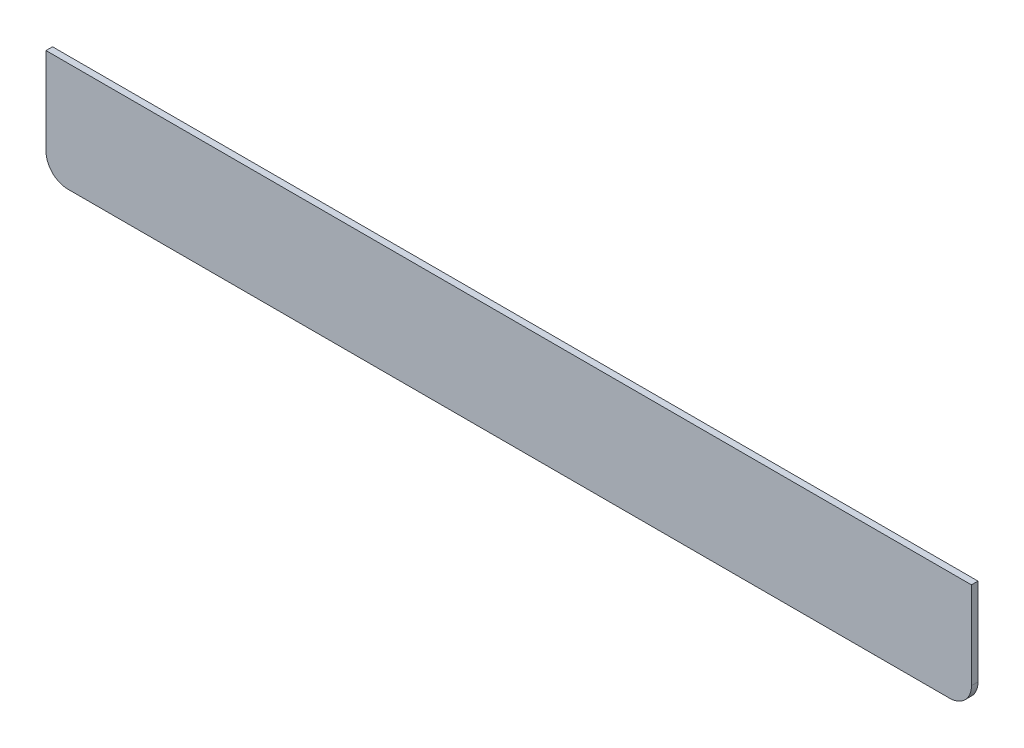
ISO-10303-21;
HEADER;
FILE_DESCRIPTION(('STEP AP214'),'2;1');
FILE_NAME('part.step','',(''),(''),'','','');
FILE_SCHEMA(('AUTOMOTIVE_DESIGN { 1 0 10303 214 1 1 1 1 }'));
ENDSEC;
DATA;
#1=APPLICATION_CONTEXT('core data for automotive mechanical design processes');
#2=APPLICATION_PROTOCOL_DEFINITION('international standard','automotive_design',2000,#1);
#3=PRODUCT_CONTEXT('',#1,'mechanical');
#4=PRODUCT('Part','Part','',(#3));
#5=PRODUCT_RELATED_PRODUCT_CATEGORY('part','',(#4));
#6=PRODUCT_DEFINITION_FORMATION('','',#4);
#7=PRODUCT_DEFINITION_CONTEXT('part definition',#1,'design');
#8=PRODUCT_DEFINITION('design','',#6,#7);
#9=PRODUCT_DEFINITION_SHAPE('','',#8);
#10=(LENGTH_UNIT() NAMED_UNIT(*) SI_UNIT(.MILLI.,.METRE.));
#11=(NAMED_UNIT(*) PLANE_ANGLE_UNIT() SI_UNIT($,.RADIAN.));
#12=(NAMED_UNIT(*) SI_UNIT($,.STERADIAN.) SOLID_ANGLE_UNIT());
#13=UNCERTAINTY_MEASURE_WITH_UNIT(LENGTH_MEASURE(1.E-05),#10,'distance_accuracy_value','');
#14=(GEOMETRIC_REPRESENTATION_CONTEXT(3) GLOBAL_UNCERTAINTY_ASSIGNED_CONTEXT((#13)) GLOBAL_UNIT_ASSIGNED_CONTEXT((#10,
#11,#12)) REPRESENTATION_CONTEXT('',''));
#15=CARTESIAN_POINT('',(0.,0.,0.));
#16=DIRECTION('',(0.,0.,1.));
#17=DIRECTION('',(1.,0.,0.));
#18=AXIS2_PLACEMENT_3D('',#15,#16,#17);
#19=CARTESIAN_POINT('',(212.,-25.,3.));
#20=DIRECTION('',(-1.,0.,0.));
#21=DIRECTION('',(0.,0.,1.));
#22=AXIS2_PLACEMENT_3D('',#19,#20,#21);
#23=PLANE('',#22);
#24=DIRECTION('',(0.,1.,0.));
#25=VECTOR('',#24,1.);
#26=CARTESIAN_POINT('',(212.,-25.,3.));
#27=LINE('',#26,#25);
#28=CARTESIAN_POINT('',(212.,-15.,3.));
#29=VERTEX_POINT('',#28);
#30=CARTESIAN_POINT('',(212.,25.,3.));
#31=VERTEX_POINT('',#30);
#32=EDGE_CURVE('E95',#29,#31,#27,.T.);
#33=ORIENTED_EDGE('',*,*,#32,.F.);
#34=DIRECTION('',(0.,0.,-1.));
#35=VECTOR('',#34,1.);
#36=CARTESIAN_POINT('',(212.,-15.,3.));
#37=LINE('',#36,#35);
#38=CARTESIAN_POINT('',(212.,-15.,0.));
#39=VERTEX_POINT('',#38);
#40=EDGE_CURVE('E118',#29,#39,#37,.T.);
#41=ORIENTED_EDGE('',*,*,#40,.T.);
#42=DIRECTION('',(0.,1.,0.));
#43=VECTOR('',#42,1.);
#44=CARTESIAN_POINT('',(212.,-25.,0.));
#45=LINE('',#44,#43);
#46=CARTESIAN_POINT('',(212.,25.,0.));
#47=VERTEX_POINT('',#46);
#48=EDGE_CURVE('E116',#39,#47,#45,.T.);
#49=ORIENTED_EDGE('',*,*,#48,.T.);
#50=DIRECTION('',(0.,0.,-1.));
#51=VECTOR('',#50,1.);
#52=CARTESIAN_POINT('',(212.,25.,3.));
#53=LINE('',#52,#51);
#54=EDGE_CURVE('E110',#31,#47,#53,.T.);
#55=ORIENTED_EDGE('',*,*,#54,.F.);
#56=EDGE_LOOP('',(#33,#41,#49,#55));
#57=FACE_BOUND('',#56,.T.);
#58=ADVANCED_FACE('F41',(#57),#23,.F.);
#59=CARTESIAN_POINT('',(-212.,25.,3.));
#60=DIRECTION('',(0.,-1.,0.));
#61=DIRECTION('',(0.,0.,-1.));
#62=AXIS2_PLACEMENT_3D('',#59,#60,#61);
#63=PLANE('',#62);
#64=DIRECTION('',(-1.,0.,0.));
#65=VECTOR('',#64,1.);
#66=CARTESIAN_POINT('',(-212.,25.,0.));
#67=LINE('',#66,#65);
#68=CARTESIAN_POINT('',(-212.,25.,0.));
#69=VERTEX_POINT('',#68);
#70=EDGE_CURVE('E145',#47,#69,#67,.T.);
#71=ORIENTED_EDGE('',*,*,#70,.T.);
#72=DIRECTION('',(0.,0.,-1.));
#73=VECTOR('',#72,1.);
#74=CARTESIAN_POINT('',(-212.,25.,3.));
#75=LINE('',#74,#73);
#76=CARTESIAN_POINT('',(-212.,25.,3.));
#77=VERTEX_POINT('',#76);
#78=EDGE_CURVE('E112',#77,#69,#75,.T.);
#79=ORIENTED_EDGE('',*,*,#78,.F.);
#80=DIRECTION('',(-1.,0.,0.));
#81=VECTOR('',#80,1.);
#82=CARTESIAN_POINT('',(-212.,25.,3.));
#83=LINE('',#82,#81);
#84=EDGE_CURVE('E98',#31,#77,#83,.T.);
#85=ORIENTED_EDGE('',*,*,#84,.F.);
#86=ORIENTED_EDGE('',*,*,#54,.T.);
#87=EDGE_LOOP('',(#71,#79,#85,#86));
#88=FACE_BOUND('',#87,.T.);
#89=ADVANCED_FACE('F109',(#88),#63,.F.);
#90=CARTESIAN_POINT('',(-212.,-25.,3.));
#91=DIRECTION('',(1.,0.,0.));
#92=DIRECTION('',(0.,0.,-1.));
#93=AXIS2_PLACEMENT_3D('',#90,#91,#92);
#94=PLANE('',#93);
#95=DIRECTION('',(0.,-1.,0.));
#96=VECTOR('',#95,1.);
#97=CARTESIAN_POINT('',(-212.,-25.,0.));
#98=LINE('',#97,#96);
#99=CARTESIAN_POINT('',(-212.,-15.,0.));
#100=VERTEX_POINT('',#99);
#101=EDGE_CURVE('E143',#69,#100,#98,.T.);
#102=ORIENTED_EDGE('',*,*,#101,.T.);
#103=DIRECTION('',(0.,0.,-1.));
#104=VECTOR('',#103,1.);
#105=CARTESIAN_POINT('',(-212.,-15.,3.));
#106=LINE('',#105,#104);
#107=CARTESIAN_POINT('',(-212.,-15.,3.));
#108=VERTEX_POINT('',#107);
#109=EDGE_CURVE('E11',#100,#108,#106,.F.);
#110=ORIENTED_EDGE('',*,*,#109,.T.);
#111=DIRECTION('',(0.,-1.,0.));
#112=VECTOR('',#111,1.);
#113=CARTESIAN_POINT('',(-212.,-25.,3.));
#114=LINE('',#113,#112);
#115=EDGE_CURVE('E113',#77,#108,#114,.T.);
#116=ORIENTED_EDGE('',*,*,#115,.F.);
#117=ORIENTED_EDGE('',*,*,#78,.T.);
#118=EDGE_LOOP('',(#102,#110,#116,#117));
#119=FACE_BOUND('',#118,.T.);
#120=ADVANCED_FACE('F144',(#119),#94,.F.);
#121=CARTESIAN_POINT('',(-212.,-25.,3.));
#122=DIRECTION('',(0.,1.,0.));
#123=DIRECTION('',(0.,0.,1.));
#124=AXIS2_PLACEMENT_3D('',#121,#122,#123);
#125=PLANE('',#124);
#126=DIRECTION('',(1.,0.,0.));
#127=VECTOR('',#126,1.);
#128=CARTESIAN_POINT('',(-212.,-25.,0.));
#129=LINE('',#128,#127);
#130=CARTESIAN_POINT('',(-202.,-25.,0.));
#131=VERTEX_POINT('',#130);
#132=CARTESIAN_POINT('',(202.,-25.,0.));
#133=VERTEX_POINT('',#132);
#134=EDGE_CURVE('E105',#131,#133,#129,.T.);
#135=ORIENTED_EDGE('',*,*,#134,.T.);
#136=DIRECTION('',(0.,0.,-1.));
#137=VECTOR('',#136,1.);
#138=CARTESIAN_POINT('',(202.,-25.,3.));
#139=LINE('',#138,#137);
#140=CARTESIAN_POINT('',(202.,-25.,3.));
#141=VERTEX_POINT('',#140);
#142=EDGE_CURVE('E62',#133,#141,#139,.F.);
#143=ORIENTED_EDGE('',*,*,#142,.T.);
#144=DIRECTION('',(1.,0.,0.));
#145=VECTOR('',#144,1.);
#146=CARTESIAN_POINT('',(-212.,-25.,3.));
#147=LINE('',#146,#145);
#148=CARTESIAN_POINT('',(-202.,-25.,3.));
#149=VERTEX_POINT('',#148);
#150=EDGE_CURVE('E122',#149,#141,#147,.T.);
#151=ORIENTED_EDGE('',*,*,#150,.F.);
#152=DIRECTION('',(0.,0.,-1.));
#153=VECTOR('',#152,1.);
#154=CARTESIAN_POINT('',(-202.,-25.,3.));
#155=LINE('',#154,#153);
#156=EDGE_CURVE('E129',#149,#131,#155,.T.);
#157=ORIENTED_EDGE('',*,*,#156,.T.);
#158=EDGE_LOOP('',(#135,#143,#151,#157));
#159=FACE_BOUND('',#158,.T.);
#160=ADVANCED_FACE('F137',(#159),#125,.F.);
#161=CARTESIAN_POINT('',(0.,0.,3.));
#162=DIRECTION('',(0.,0.,-1.));
#163=DIRECTION('',(-1.,0.,0.));
#164=AXIS2_PLACEMENT_3D('',#161,#162,#163);
#165=PLANE('',#164);
#166=ORIENTED_EDGE('',*,*,#150,.T.);
#167=CARTESIAN_POINT('',(202.,-15.,3.));
#168=DIRECTION('',(0.,0.,-1.));
#169=DIRECTION('',(-1.,0.,0.));
#170=AXIS2_PLACEMENT_3D('',#167,#168,#169);
#171=CIRCLE('',#170,10.);
#172=EDGE_CURVE('E49',#141,#29,#171,.F.);
#173=ORIENTED_EDGE('',*,*,#172,.T.);
#174=ORIENTED_EDGE('',*,*,#32,.T.);
#175=ORIENTED_EDGE('',*,*,#84,.T.);
#176=ORIENTED_EDGE('',*,*,#115,.T.);
#177=CARTESIAN_POINT('',(-202.,-15.,3.));
#178=DIRECTION('',(0.,0.,-1.));
#179=DIRECTION('',(-1.,0.,0.));
#180=AXIS2_PLACEMENT_3D('',#177,#178,#179);
#181=CIRCLE('',#180,10.);
#182=EDGE_CURVE('E133',#108,#149,#181,.F.);
#183=ORIENTED_EDGE('',*,*,#182,.T.);
#184=EDGE_LOOP('',(#166,#173,#174,#175,#176,#183));
#185=FACE_BOUND('',#184,.T.);
#186=ADVANCED_FACE('F97',(#185),#165,.F.);
#187=CARTESIAN_POINT('',(0.,0.,0.));
#188=DIRECTION('',(0.,0.,-1.));
#189=DIRECTION('',(-1.,0.,0.));
#190=AXIS2_PLACEMENT_3D('',#187,#188,#189);
#191=PLANE('',#190);
#192=ORIENTED_EDGE('',*,*,#48,.F.);
#193=CARTESIAN_POINT('',(202.,-15.,0.));
#194=DIRECTION('',(0.,0.,-1.));
#195=DIRECTION('',(-1.,0.,0.));
#196=AXIS2_PLACEMENT_3D('',#193,#194,#195);
#197=CIRCLE('',#196,10.);
#198=EDGE_CURVE('E127',#39,#133,#197,.T.);
#199=ORIENTED_EDGE('',*,*,#198,.T.);
#200=ORIENTED_EDGE('',*,*,#134,.F.);
#201=CARTESIAN_POINT('',(-202.,-15.,0.));
#202=DIRECTION('',(0.,0.,-1.));
#203=DIRECTION('',(-1.,0.,0.));
#204=AXIS2_PLACEMENT_3D('',#201,#202,#203);
#205=CIRCLE('',#204,10.);
#206=EDGE_CURVE('E120',#131,#100,#205,.T.);
#207=ORIENTED_EDGE('',*,*,#206,.T.);
#208=ORIENTED_EDGE('',*,*,#101,.F.);
#209=ORIENTED_EDGE('',*,*,#70,.F.);
#210=EDGE_LOOP('',(#192,#199,#200,#207,#208,#209));
#211=FACE_BOUND('',#210,.T.);
#212=ADVANCED_FACE('F142',(#211),#191,.T.);
#213=CARTESIAN_POINT('',(202.,-15.,3.));
#214=DIRECTION('',(0.,0.,-1.));
#215=DIRECTION('',(-1.,0.,0.));
#216=AXIS2_PLACEMENT_3D('',#213,#214,#215);
#217=CYLINDRICAL_SURFACE('',#216,10.);
#218=ORIENTED_EDGE('',*,*,#172,.F.);
#219=ORIENTED_EDGE('',*,*,#142,.F.);
#220=ORIENTED_EDGE('',*,*,#198,.F.);
#221=ORIENTED_EDGE('',*,*,#40,.F.);
#222=EDGE_LOOP('',(#218,#219,#220,#221));
#223=FACE_BOUND('',#222,.T.);
#224=ADVANCED_FACE('F151',(#223),#217,.T.);
#225=CARTESIAN_POINT('',(-202.,-15.,3.));
#226=DIRECTION('',(0.,0.,-1.));
#227=DIRECTION('',(-1.,0.,0.));
#228=AXIS2_PLACEMENT_3D('',#225,#226,#227);
#229=CYLINDRICAL_SURFACE('',#228,10.);
#230=ORIENTED_EDGE('',*,*,#182,.F.);
#231=ORIENTED_EDGE('',*,*,#109,.F.);
#232=ORIENTED_EDGE('',*,*,#206,.F.);
#233=ORIENTED_EDGE('',*,*,#156,.F.);
#234=EDGE_LOOP('',(#230,#231,#232,#233));
#235=FACE_BOUND('',#234,.T.);
#236=ADVANCED_FACE('F43',(#235),#229,.T.);
#237=CLOSED_SHELL('',(#58,#89,#120,#160,#186,#212,#224,#236));
#238=MANIFOLD_SOLID_BREP('B2',#237);
#239=ADVANCED_BREP_SHAPE_REPRESENTATION('',(#18,#238),#14);
#240=SHAPE_DEFINITION_REPRESENTATION(#9,#239);
ENDSEC;
END-ISO-10303-21;
